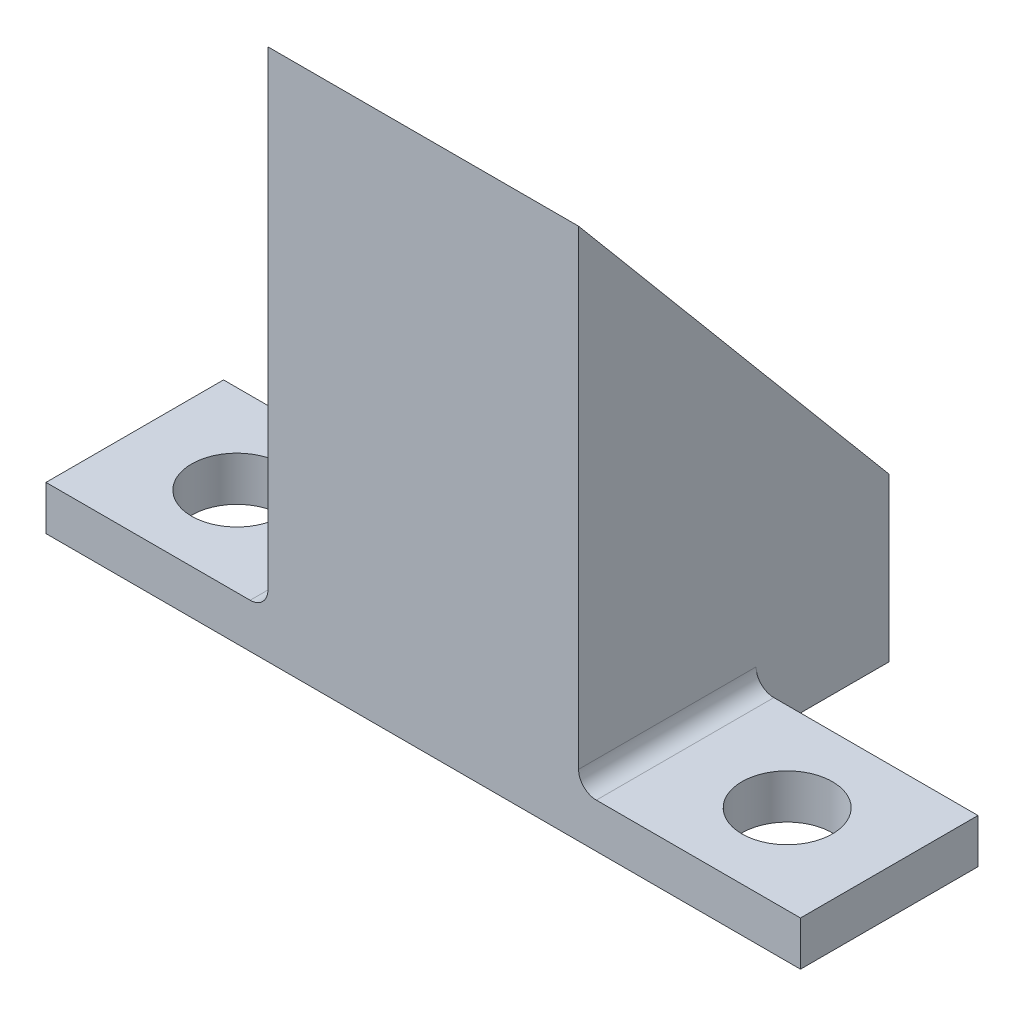
ISO-10303-21;
HEADER;
FILE_DESCRIPTION(('STEP AP214'),'2;1');
FILE_NAME('part.step','',(''),(''),'','','');
FILE_SCHEMA(('AUTOMOTIVE_DESIGN { 1 0 10303 214 1 1 1 1 }'));
ENDSEC;
DATA;
#1=APPLICATION_CONTEXT('core data for automotive mechanical design processes');
#2=APPLICATION_PROTOCOL_DEFINITION('international standard','automotive_design',2000,#1);
#3=PRODUCT_CONTEXT('',#1,'mechanical');
#4=PRODUCT('Part','Part','',(#3));
#5=PRODUCT_RELATED_PRODUCT_CATEGORY('part','',(#4));
#6=PRODUCT_DEFINITION_FORMATION('','',#4);
#7=PRODUCT_DEFINITION_CONTEXT('part definition',#1,'design');
#8=PRODUCT_DEFINITION('design','',#6,#7);
#9=PRODUCT_DEFINITION_SHAPE('','',#8);
#10=(LENGTH_UNIT() NAMED_UNIT(*) SI_UNIT(.MILLI.,.METRE.));
#11=(NAMED_UNIT(*) PLANE_ANGLE_UNIT() SI_UNIT($,.RADIAN.));
#12=(NAMED_UNIT(*) SI_UNIT($,.STERADIAN.) SOLID_ANGLE_UNIT());
#13=UNCERTAINTY_MEASURE_WITH_UNIT(LENGTH_MEASURE(1.E-05),#10,'distance_accuracy_value','');
#14=(GEOMETRIC_REPRESENTATION_CONTEXT(3) GLOBAL_UNCERTAINTY_ASSIGNED_CONTEXT((#13)) GLOBAL_UNIT_ASSIGNED_CONTEXT((#10,
#11,#12)) REPRESENTATION_CONTEXT('',''));
#15=CARTESIAN_POINT('',(0.,0.,0.));
#16=DIRECTION('',(0.,0.,1.));
#17=DIRECTION('',(1.,0.,0.));
#18=AXIS2_PLACEMENT_3D('',#15,#16,#17);
#19=CARTESIAN_POINT('',(0.,76.2,0.));
#20=DIRECTION('',(1.,0.,0.));
#21=DIRECTION('',(0.,0.,-1.));
#22=AXIS2_PLACEMENT_3D('',#19,#20,#21);
#23=PLANE('',#22);
#24=DIRECTION('',(0.,-1.,0.));
#25=VECTOR('',#24,1.);
#26=CARTESIAN_POINT('',(0.,0.,-25.4));
#27=LINE('',#26,#25);
#28=CARTESIAN_POINT('',(0.,8.89,-25.4));
#29=VERTEX_POINT('',#28);
#30=CARTESIAN_POINT('',(0.,0.,-25.4));
#31=VERTEX_POINT('',#30);
#32=EDGE_CURVE('E50',#29,#31,#27,.T.);
#33=ORIENTED_EDGE('',*,*,#32,.F.);
#34=DIRECTION('',(0.,0.,-1.));
#35=VECTOR('',#34,1.);
#36=CARTESIAN_POINT('',(0.,8.89,0.));
#37=LINE('',#36,#35);
#38=CARTESIAN_POINT('',(0.,8.89000000000002,0.));
#39=VERTEX_POINT('',#38);
#40=EDGE_CURVE('E55',#29,#39,#37,.F.);
#41=ORIENTED_EDGE('',*,*,#40,.T.);
#42=DIRECTION('',(0.,-1.,0.));
#43=VECTOR('',#42,1.);
#44=CARTESIAN_POINT('',(0.,76.2,0.));
#45=LINE('',#44,#43);
#46=CARTESIAN_POINT('',(0.,76.2,0.));
#47=VERTEX_POINT('',#46);
#48=EDGE_CURVE('E202',#47,#39,#45,.T.);
#49=ORIENTED_EDGE('',*,*,#48,.F.);
#50=DIRECTION('',(0.,-0.766044443118974,-0.642787609686544));
#51=VECTOR('',#50,1.);
#52=CARTESIAN_POINT('',(0.,76.2,0.));
#53=LINE('',#52,#51);
#54=CARTESIAN_POINT('',(0.,23.226552809188,-44.45));
#55=VERTEX_POINT('',#54);
#56=EDGE_CURVE('E188',#47,#55,#53,.T.);
#57=ORIENTED_EDGE('',*,*,#56,.T.);
#58=DIRECTION('',(0.,-1.,0.));
#59=VECTOR('',#58,1.);
#60=CARTESIAN_POINT('',(0.,76.2,-44.45));
#61=LINE('',#60,#59);
#62=CARTESIAN_POINT('',(0.,0.,-44.45));
#63=VERTEX_POINT('',#62);
#64=EDGE_CURVE('E185',#55,#63,#61,.T.);
#65=ORIENTED_EDGE('',*,*,#64,.T.);
#66=DIRECTION('',(0.,0.,1.));
#67=VECTOR('',#66,1.);
#68=CARTESIAN_POINT('',(0.,0.,0.));
#69=LINE('',#68,#67);
#70=EDGE_CURVE('E191',#63,#31,#69,.T.);
#71=ORIENTED_EDGE('',*,*,#70,.T.);
#72=EDGE_LOOP('',(#33,#41,#49,#57,#65,#71));
#73=FACE_BOUND('',#72,.T.);
#74=ADVANCED_FACE('F35',(#73),#23,.F.);
#75=CARTESIAN_POINT('',(44.45,76.2,0.));
#76=DIRECTION('',(-1.,0.,0.));
#77=DIRECTION('',(0.,0.,1.));
#78=AXIS2_PLACEMENT_3D('',#75,#76,#77);
#79=PLANE('',#78);
#80=DIRECTION('',(0.,-1.,0.));
#81=VECTOR('',#80,1.);
#82=CARTESIAN_POINT('',(44.45,76.2,0.));
#83=LINE('',#82,#81);
#84=CARTESIAN_POINT('',(44.45,76.2,0.));
#85=VERTEX_POINT('',#84);
#86=CARTESIAN_POINT('',(44.45,8.89000000000002,0.));
#87=VERTEX_POINT('',#86);
#88=EDGE_CURVE('E194',#85,#87,#83,.T.);
#89=ORIENTED_EDGE('',*,*,#88,.T.);
#90=DIRECTION('',(0.,0.,1.));
#91=VECTOR('',#90,1.);
#92=CARTESIAN_POINT('',(44.45,8.89,-25.4));
#93=LINE('',#92,#91);
#94=CARTESIAN_POINT('',(44.45,8.89,-25.4));
#95=VERTEX_POINT('',#94);
#96=EDGE_CURVE('E209',#87,#95,#93,.F.);
#97=ORIENTED_EDGE('',*,*,#96,.T.);
#98=DIRECTION('',(0.,1.,0.));
#99=VECTOR('',#98,1.);
#100=CARTESIAN_POINT('',(44.45,0.,-25.4));
#101=LINE('',#100,#99);
#102=CARTESIAN_POINT('',(44.45,0.,-25.4));
#103=VERTEX_POINT('',#102);
#104=EDGE_CURVE('E157',#103,#95,#101,.T.);
#105=ORIENTED_EDGE('',*,*,#104,.F.);
#106=DIRECTION('',(0.,0.,-1.));
#107=VECTOR('',#106,1.);
#108=CARTESIAN_POINT('',(44.45,0.,0.));
#109=LINE('',#108,#107);
#110=CARTESIAN_POINT('',(44.45,0.,-44.45));
#111=VERTEX_POINT('',#110);
#112=EDGE_CURVE('E195',#103,#111,#109,.T.);
#113=ORIENTED_EDGE('',*,*,#112,.T.);
#114=DIRECTION('',(0.,-1.,0.));
#115=VECTOR('',#114,1.);
#116=CARTESIAN_POINT('',(44.45,0.,-44.45));
#117=LINE('',#116,#115);
#118=CARTESIAN_POINT('',(44.45,23.226552809188,-44.45));
#119=VERTEX_POINT('',#118);
#120=EDGE_CURVE('E180',#119,#111,#117,.T.);
#121=ORIENTED_EDGE('',*,*,#120,.F.);
#122=DIRECTION('',(0.,-0.766044443118974,-0.642787609686544));
#123=VECTOR('',#122,1.);
#124=CARTESIAN_POINT('',(44.45,31.4840044308904,-37.5211753897652));
#125=LINE('',#124,#123);
#126=EDGE_CURVE('E177',#85,#119,#125,.T.);
#127=ORIENTED_EDGE('',*,*,#126,.F.);
#128=EDGE_LOOP('',(#89,#97,#105,#113,#121,#127));
#129=FACE_BOUND('',#128,.T.);
#130=ADVANCED_FACE('F231',(#129),#79,.F.);
#131=CARTESIAN_POINT('',(0.,76.2,0.));
#132=DIRECTION('',(0.,0.,-1.));
#133=DIRECTION('',(-1.,0.,0.));
#134=AXIS2_PLACEMENT_3D('',#131,#132,#133);
#135=PLANE('',#134);
#136=DIRECTION('',(1.,0.,0.));
#137=VECTOR('',#136,1.);
#138=CARTESIAN_POINT('',(0.,0.,0.));
#139=LINE('',#138,#137);
#140=CARTESIAN_POINT('',(-31.75,0.,0.));
#141=VERTEX_POINT('',#140);
#142=CARTESIAN_POINT('',(76.2,0.,0.));
#143=VERTEX_POINT('',#142);
#144=EDGE_CURVE('E197',#141,#143,#139,.T.);
#145=ORIENTED_EDGE('',*,*,#144,.T.);
#146=DIRECTION('',(0.,-1.,0.));
#147=VECTOR('',#146,1.);
#148=CARTESIAN_POINT('',(76.2,0.,0.));
#149=LINE('',#148,#147);
#150=CARTESIAN_POINT('',(76.2,6.35,0.));
#151=VERTEX_POINT('',#150);
#152=EDGE_CURVE('E158',#151,#143,#149,.T.);
#153=ORIENTED_EDGE('',*,*,#152,.F.);
#154=DIRECTION('',(-1.,0.,0.));
#155=VECTOR('',#154,1.);
#156=CARTESIAN_POINT('',(76.2,6.35,0.));
#157=LINE('',#156,#155);
#158=CARTESIAN_POINT('',(46.99,6.35,0.));
#159=VERTEX_POINT('',#158);
#160=EDGE_CURVE('E167',#151,#159,#157,.T.);
#161=ORIENTED_EDGE('',*,*,#160,.T.);
#162=CARTESIAN_POINT('',(46.99,8.89,0.));
#163=DIRECTION('',(0.,0.,-1.));
#164=DIRECTION('',(-1.,0.,0.));
#165=AXIS2_PLACEMENT_3D('',#162,#163,#164);
#166=CIRCLE('',#165,2.54);
#167=EDGE_CURVE('E212',#159,#87,#166,.T.);
#168=ORIENTED_EDGE('',*,*,#167,.T.);
#169=ORIENTED_EDGE('',*,*,#88,.F.);
#170=DIRECTION('',(1.,0.,0.));
#171=VECTOR('',#170,1.);
#172=CARTESIAN_POINT('',(0.,76.2,0.));
#173=LINE('',#172,#171);
#174=EDGE_CURVE('E192',#47,#85,#173,.T.);
#175=ORIENTED_EDGE('',*,*,#174,.F.);
#176=ORIENTED_EDGE('',*,*,#48,.T.);
#177=CARTESIAN_POINT('',(-2.54,8.89,0.));
#178=DIRECTION('',(0.,0.,-1.));
#179=DIRECTION('',(-1.,0.,0.));
#180=AXIS2_PLACEMENT_3D('',#177,#178,#179);
#181=CIRCLE('',#180,2.54);
#182=CARTESIAN_POINT('',(-2.54,6.35,0.));
#183=VERTEX_POINT('',#182);
#184=EDGE_CURVE('E11',#39,#183,#181,.T.);
#185=ORIENTED_EDGE('',*,*,#184,.T.);
#186=DIRECTION('',(1.,0.,0.));
#187=VECTOR('',#186,1.);
#188=CARTESIAN_POINT('',(-31.75,6.35,0.));
#189=LINE('',#188,#187);
#190=CARTESIAN_POINT('',(-31.75,6.35,0.));
#191=VERTEX_POINT('',#190);
#192=EDGE_CURVE('E128',#191,#183,#189,.T.);
#193=ORIENTED_EDGE('',*,*,#192,.F.);
#194=DIRECTION('',(0.,1.,0.));
#195=VECTOR('',#194,1.);
#196=CARTESIAN_POINT('',(-31.75,0.,0.));
#197=LINE('',#196,#195);
#198=EDGE_CURVE('E135',#141,#191,#197,.T.);
#199=ORIENTED_EDGE('',*,*,#198,.F.);
#200=EDGE_LOOP('',(#145,#153,#161,#168,#169,#175,#176,#185,#193,#199));
#201=FACE_BOUND('',#200,.T.);
#202=ADVANCED_FACE('F144',(#201),#135,.F.);
#203=CARTESIAN_POINT('',(0.,0.,0.));
#204=DIRECTION('',(0.,-1.,0.));
#205=DIRECTION('',(0.,0.,-1.));
#206=AXIS2_PLACEMENT_3D('',#203,#204,#205);
#207=PLANE('',#206);
#208=CARTESIAN_POINT('',(-17.145,0.,-12.7));
#209=DIRECTION('',(0.,-1.,0.));
#210=DIRECTION('',(0.,0.,-1.));
#211=AXIS2_PLACEMENT_3D('',#208,#209,#210);
#212=CIRCLE('',#211,6.47699999999998);
#213=CARTESIAN_POINT('',(-17.145,0.,-6.22300000000001));
#214=VERTEX_POINT('',#213);
#215=EDGE_CURVE('E283',#214,#214,#212,.F.);
#216=ORIENTED_EDGE('',*,*,#215,.T.);
#217=EDGE_LOOP('',(#216));
#218=FACE_BOUND('',#217,.T.);
#219=CARTESIAN_POINT('',(61.595,0.,-12.7));
#220=DIRECTION('',(0.,-1.,0.));
#221=DIRECTION('',(0.,0.,-1.));
#222=AXIS2_PLACEMENT_3D('',#219,#220,#221);
#223=CIRCLE('',#222,6.47699999999998);
#224=CARTESIAN_POINT('',(61.595,0.,-6.22300000000001));
#225=VERTEX_POINT('',#224);
#226=EDGE_CURVE('E149',#225,#225,#223,.T.);
#227=ORIENTED_EDGE('',*,*,#226,.F.);
#228=EDGE_LOOP('',(#227));
#229=FACE_BOUND('',#228,.T.);
#230=DIRECTION('',(-1.,0.,0.));
#231=VECTOR('',#230,1.);
#232=CARTESIAN_POINT('',(0.,0.,-44.45));
#233=LINE('',#232,#231);
#234=EDGE_CURVE('E204',#111,#63,#233,.T.);
#235=ORIENTED_EDGE('',*,*,#234,.F.);
#236=ORIENTED_EDGE('',*,*,#112,.F.);
#237=DIRECTION('',(-1.,0.,0.));
#238=VECTOR('',#237,1.);
#239=CARTESIAN_POINT('',(76.2,0.,-25.4));
#240=LINE('',#239,#238);
#241=CARTESIAN_POINT('',(76.2,0.,-25.4));
#242=VERTEX_POINT('',#241);
#243=EDGE_CURVE('E174',#242,#103,#240,.T.);
#244=ORIENTED_EDGE('',*,*,#243,.F.);
#245=DIRECTION('',(0.,0.,-1.));
#246=VECTOR('',#245,1.);
#247=CARTESIAN_POINT('',(76.2,0.,0.));
#248=LINE('',#247,#246);
#249=EDGE_CURVE('E161',#143,#242,#248,.T.);
#250=ORIENTED_EDGE('',*,*,#249,.F.);
#251=ORIENTED_EDGE('',*,*,#144,.F.);
#252=DIRECTION('',(0.,0.,1.));
#253=VECTOR('',#252,1.);
#254=CARTESIAN_POINT('',(-31.75,0.,0.));
#255=LINE('',#254,#253);
#256=CARTESIAN_POINT('',(-31.75,0.,-25.4));
#257=VERTEX_POINT('',#256);
#258=EDGE_CURVE('E141',#257,#141,#255,.T.);
#259=ORIENTED_EDGE('',*,*,#258,.F.);
#260=DIRECTION('',(1.,0.,0.));
#261=VECTOR('',#260,1.);
#262=CARTESIAN_POINT('',(-31.75,0.,-25.4));
#263=LINE('',#262,#261);
#264=EDGE_CURVE('E151',#257,#31,#263,.T.);
#265=ORIENTED_EDGE('',*,*,#264,.T.);
#266=ORIENTED_EDGE('',*,*,#70,.F.);
#267=EDGE_LOOP('',(#235,#236,#244,#250,#251,#259,#265,#266));
#268=FACE_BOUND('',#267,.T.);
#269=ADVANCED_FACE('F269',(#218,#229,#268),#207,.T.);
#270=CARTESIAN_POINT('',(-31.75,31.4840044308904,-37.5211753897652));
#271=DIRECTION('',(0.,-0.642787609686544,0.766044443118974));
#272=DIRECTION('',(0.,-0.766044443118974,-0.642787609686544));
#273=AXIS2_PLACEMENT_3D('',#270,#271,#272);
#274=PLANE('',#273);
#275=ORIENTED_EDGE('',*,*,#174,.T.);
#276=ORIENTED_EDGE('',*,*,#126,.T.);
#277=DIRECTION('',(1.,0.,0.));
#278=VECTOR('',#277,1.);
#279=CARTESIAN_POINT('',(-31.75,23.226552809188,-44.45));
#280=LINE('',#279,#278);
#281=EDGE_CURVE('E183',#55,#119,#280,.T.);
#282=ORIENTED_EDGE('',*,*,#281,.F.);
#283=ORIENTED_EDGE('',*,*,#56,.F.);
#284=EDGE_LOOP('',(#275,#276,#282,#283));
#285=FACE_BOUND('',#284,.T.);
#286=ADVANCED_FACE('F277',(#285),#274,.F.);
#287=CARTESIAN_POINT('',(-31.75,0.,-44.45));
#288=DIRECTION('',(0.,0.,1.));
#289=DIRECTION('',(1.,0.,0.));
#290=AXIS2_PLACEMENT_3D('',#287,#288,#289);
#291=PLANE('',#290);
#292=ORIENTED_EDGE('',*,*,#281,.T.);
#293=ORIENTED_EDGE('',*,*,#120,.T.);
#294=ORIENTED_EDGE('',*,*,#234,.T.);
#295=ORIENTED_EDGE('',*,*,#64,.F.);
#296=EDGE_LOOP('',(#292,#293,#294,#295));
#297=FACE_BOUND('',#296,.T.);
#298=ADVANCED_FACE('F274',(#297),#291,.F.);
#299=CARTESIAN_POINT('',(76.2,0.,-25.4));
#300=DIRECTION('',(0.,0.,1.));
#301=DIRECTION('',(0.,-1.,0.));
#302=AXIS2_PLACEMENT_3D('',#299,#300,#301);
#303=PLANE('',#302);
#304=ORIENTED_EDGE('',*,*,#104,.T.);
#305=CARTESIAN_POINT('',(46.99,8.89,-25.4));
#306=DIRECTION('',(0.,0.,1.));
#307=DIRECTION('',(0.,-1.,0.));
#308=AXIS2_PLACEMENT_3D('',#305,#306,#307);
#309=CIRCLE('',#308,2.54);
#310=CARTESIAN_POINT('',(46.99,6.35,-25.4));
#311=VERTEX_POINT('',#310);
#312=EDGE_CURVE('E214',#95,#311,#309,.T.);
#313=ORIENTED_EDGE('',*,*,#312,.T.);
#314=DIRECTION('',(-1.,0.,0.));
#315=VECTOR('',#314,1.);
#316=CARTESIAN_POINT('',(76.2,6.35,-25.4));
#317=LINE('',#316,#315);
#318=CARTESIAN_POINT('',(76.2,6.35,-25.4));
#319=VERTEX_POINT('',#318);
#320=EDGE_CURVE('E171',#319,#311,#317,.T.);
#321=ORIENTED_EDGE('',*,*,#320,.F.);
#322=DIRECTION('',(0.,1.,0.));
#323=VECTOR('',#322,1.);
#324=CARTESIAN_POINT('',(76.2,0.,-25.4));
#325=LINE('',#324,#323);
#326=EDGE_CURVE('E163',#242,#319,#325,.T.);
#327=ORIENTED_EDGE('',*,*,#326,.F.);
#328=ORIENTED_EDGE('',*,*,#243,.T.);
#329=EDGE_LOOP('',(#304,#313,#321,#327,#328));
#330=FACE_BOUND('',#329,.T.);
#331=ADVANCED_FACE('F258',(#330),#303,.F.);
#332=CARTESIAN_POINT('',(76.2,6.35,0.));
#333=DIRECTION('',(0.,-1.,0.));
#334=DIRECTION('',(0.,0.,-1.));
#335=AXIS2_PLACEMENT_3D('',#332,#333,#334);
#336=PLANE('',#335);
#337=CARTESIAN_POINT('',(61.595,6.35,-12.7));
#338=DIRECTION('',(0.,1.,0.));
#339=DIRECTION('',(0.,0.,1.));
#340=AXIS2_PLACEMENT_3D('',#337,#338,#339);
#341=CIRCLE('',#340,6.47699999999998);
#342=CARTESIAN_POINT('',(61.595,6.35,-6.22300000000001));
#343=VERTEX_POINT('',#342);
#344=EDGE_CURVE('E146',#343,#343,#341,.T.);
#345=ORIENTED_EDGE('',*,*,#344,.F.);
#346=EDGE_LOOP('',(#345));
#347=FACE_BOUND('',#346,.T.);
#348=ORIENTED_EDGE('',*,*,#320,.T.);
#349=DIRECTION('',(0.,0.,1.));
#350=VECTOR('',#349,1.);
#351=CARTESIAN_POINT('',(46.99,6.35,0.));
#352=LINE('',#351,#350);
#353=EDGE_CURVE('E206',#311,#159,#352,.T.);
#354=ORIENTED_EDGE('',*,*,#353,.T.);
#355=ORIENTED_EDGE('',*,*,#160,.F.);
#356=DIRECTION('',(0.,0.,1.));
#357=VECTOR('',#356,1.);
#358=CARTESIAN_POINT('',(76.2,6.35,0.));
#359=LINE('',#358,#357);
#360=EDGE_CURVE('E165',#319,#151,#359,.T.);
#361=ORIENTED_EDGE('',*,*,#360,.F.);
#362=EDGE_LOOP('',(#348,#354,#355,#361));
#363=FACE_BOUND('',#362,.T.);
#364=ADVANCED_FACE('F250',(#347,#363),#336,.F.);
#365=CARTESIAN_POINT('',(76.2,0.,0.));
#366=DIRECTION('',(-1.,0.,0.));
#367=DIRECTION('',(0.,0.,1.));
#368=AXIS2_PLACEMENT_3D('',#365,#366,#367);
#369=PLANE('',#368);
#370=ORIENTED_EDGE('',*,*,#152,.T.);
#371=ORIENTED_EDGE('',*,*,#249,.T.);
#372=ORIENTED_EDGE('',*,*,#326,.T.);
#373=ORIENTED_EDGE('',*,*,#360,.T.);
#374=EDGE_LOOP('',(#370,#371,#372,#373));
#375=FACE_BOUND('',#374,.T.);
#376=ADVANCED_FACE('F242',(#375),#369,.F.);
#377=CARTESIAN_POINT('',(46.99,8.89,0.));
#378=DIRECTION('',(0.,0.,-1.));
#379=DIRECTION('',(-1.,0.,0.));
#380=AXIS2_PLACEMENT_3D('',#377,#378,#379);
#381=CYLINDRICAL_SURFACE('',#380,2.54);
#382=ORIENTED_EDGE('',*,*,#312,.F.);
#383=ORIENTED_EDGE('',*,*,#96,.F.);
#384=ORIENTED_EDGE('',*,*,#167,.F.);
#385=ORIENTED_EDGE('',*,*,#353,.F.);
#386=EDGE_LOOP('',(#382,#383,#384,#385));
#387=FACE_BOUND('',#386,.T.);
#388=ADVANCED_FACE('F239',(#387),#381,.F.);
#389=CARTESIAN_POINT('',(61.595,-31.75,-12.7));
#390=DIRECTION('',(0.,1.,0.));
#391=DIRECTION('',(0.,0.,1.));
#392=AXIS2_PLACEMENT_3D('',#389,#390,#391);
#393=CYLINDRICAL_SURFACE('',#392,6.47699999999998);
#394=CARTESIAN_POINT('',(61.595,0.,-6.22300000000001));
#395=CARTESIAN_POINT('',(61.595,0.0661458333333411,-6.22300000000001));
#396=CARTESIAN_POINT('',(61.595,0.132291666666675,-6.22300000000001));
#397=CARTESIAN_POINT('',(61.595,0.264583333333341,-6.22300000000001));
#398=CARTESIAN_POINT('',(61.595,0.330729166666673,-6.22300000000001));
#399=CARTESIAN_POINT('',(61.595,0.463020833333339,-6.22300000000001));
#400=CARTESIAN_POINT('',(61.595,0.529166666666673,-6.22300000000001));
#401=CARTESIAN_POINT('',(61.595,0.661458333333339,-6.22300000000001));
#402=CARTESIAN_POINT('',(61.595,0.727604166666671,-6.22300000000001));
#403=CARTESIAN_POINT('',(61.595,0.859895833333337,-6.22300000000001));
#404=CARTESIAN_POINT('',(61.595,0.926041666666671,-6.22300000000001));
#405=CARTESIAN_POINT('',(61.595,1.05833333333334,-6.22300000000001));
#406=CARTESIAN_POINT('',(61.595,1.12447916666667,-6.22300000000001));
#407=CARTESIAN_POINT('',(61.595,1.25677083333334,-6.22300000000001));
#408=CARTESIAN_POINT('',(61.595,1.32291666666667,-6.22300000000001));
#409=CARTESIAN_POINT('',(61.595,1.45520833333334,-6.22300000000001));
#410=CARTESIAN_POINT('',(61.595,1.52135416666667,-6.22300000000001));
#411=CARTESIAN_POINT('',(61.595,1.65364583333334,-6.22300000000001));
#412=CARTESIAN_POINT('',(61.595,1.71979166666667,-6.22300000000001));
#413=CARTESIAN_POINT('',(61.595,1.85208333333334,-6.22300000000001));
#414=CARTESIAN_POINT('',(61.595,1.91822916666667,-6.22300000000001));
#415=CARTESIAN_POINT('',(61.595,2.05052083333334,-6.22300000000001));
#416=CARTESIAN_POINT('',(61.595,2.11666666666667,-6.22300000000001));
#417=CARTESIAN_POINT('',(61.595,2.24895833333334,-6.22300000000001));
#418=CARTESIAN_POINT('',(61.595,2.31510416666667,-6.22300000000001));
#419=CARTESIAN_POINT('',(61.595,2.44739583333334,-6.22300000000001));
#420=CARTESIAN_POINT('',(61.595,2.51354166666667,-6.22300000000001));
#421=CARTESIAN_POINT('',(61.595,2.64583333333334,-6.22300000000001));
#422=CARTESIAN_POINT('',(61.595,2.71197916666667,-6.22300000000001));
#423=CARTESIAN_POINT('',(61.595,2.84427083333334,-6.22300000000001));
#424=CARTESIAN_POINT('',(61.595,2.91041666666667,-6.22300000000001));
#425=CARTESIAN_POINT('',(61.595,3.04270833333334,-6.22300000000001));
#426=CARTESIAN_POINT('',(61.595,3.10885416666667,-6.22300000000001));
#427=CARTESIAN_POINT('',(61.595,3.24114583333334,-6.22300000000001));
#428=CARTESIAN_POINT('',(61.595,3.30729166666667,-6.22300000000001));
#429=CARTESIAN_POINT('',(61.595,3.43958333333334,-6.22300000000001));
#430=CARTESIAN_POINT('',(61.595,3.50572916666667,-6.22300000000001));
#431=CARTESIAN_POINT('',(61.595,3.63802083333334,-6.22300000000001));
#432=CARTESIAN_POINT('',(61.595,3.70416666666667,-6.22300000000001));
#433=CARTESIAN_POINT('',(61.595,3.83645833333334,-6.22300000000001));
#434=CARTESIAN_POINT('',(61.595,3.90260416666667,-6.22300000000001));
#435=CARTESIAN_POINT('',(61.595,4.03489583333333,-6.22300000000001));
#436=CARTESIAN_POINT('',(61.595,4.10104166666667,-6.22300000000001));
#437=CARTESIAN_POINT('',(61.595,4.23333333333334,-6.22300000000001));
#438=CARTESIAN_POINT('',(61.595,4.29947916666667,-6.22300000000001));
#439=CARTESIAN_POINT('',(61.595,4.43177083333334,-6.22300000000001));
#440=CARTESIAN_POINT('',(61.595,4.49791666666667,-6.22300000000001));
#441=CARTESIAN_POINT('',(61.595,4.63020833333333,-6.22300000000001));
#442=CARTESIAN_POINT('',(61.595,4.69635416666667,-6.22300000000001));
#443=CARTESIAN_POINT('',(61.595,4.82864583333334,-6.22300000000001));
#444=CARTESIAN_POINT('',(61.595,4.89479166666667,-6.22300000000001));
#445=CARTESIAN_POINT('',(61.595,5.02708333333334,-6.22300000000001));
#446=CARTESIAN_POINT('',(61.595,5.09322916666667,-6.22300000000001));
#447=CARTESIAN_POINT('',(61.595,5.22552083333333,-6.22300000000001));
#448=CARTESIAN_POINT('',(61.595,5.29166666666667,-6.22300000000001));
#449=CARTESIAN_POINT('',(61.595,5.42395833333334,-6.22300000000001));
#450=CARTESIAN_POINT('',(61.595,5.49010416666667,-6.22300000000001));
#451=CARTESIAN_POINT('',(61.595,5.62239583333334,-6.22300000000001));
#452=CARTESIAN_POINT('',(61.595,5.68854166666667,-6.22300000000001));
#453=CARTESIAN_POINT('',(61.595,5.82083333333333,-6.22300000000001));
#454=CARTESIAN_POINT('',(61.595,5.88697916666667,-6.22300000000001));
#455=CARTESIAN_POINT('',(61.595,6.01927083333334,-6.22300000000001));
#456=CARTESIAN_POINT('',(61.595,6.08541666666667,-6.22300000000001));
#457=CARTESIAN_POINT('',(61.595,6.21770833333333,-6.22300000000001));
#458=CARTESIAN_POINT('',(61.595,6.28385416666667,-6.22300000000001));
#459=CARTESIAN_POINT('',(61.595,6.35,-6.22300000000001));
#460=B_SPLINE_CURVE_WITH_KNOTS('',3,(#394,#395,#396,#397,#398,#399,#400,#401,#402,#403,#404,
#405,#406,#407,#408,#409,#410,#411,#412,#413,#414,#415,#416,#417,#418,#419,#420,#421,#422,#423,
#424,#425,#426,#427,#428,#429,#430,#431,#432,#433,#434,#435,#436,#437,#438,#439,#440,#441,#442,
#443,#444,#445,#446,#447,#448,#449,#450,#451,#452,#453,#454,#455,#456,#457,#458,#459),
.UNSPECIFIED.,.F.,.F.,(4,2,2,2,2,2,2,2,2,2,2,2,2,2,2,2,2,2,2,2,2,2,2,2,2,2,2,2,2,2,2,2,4),(0.,
0.198437500000002,0.396874999999998,0.5953125,0.793749999999996,0.992187499999998,1.190625,
1.3890625,1.5875,1.7859375,1.984375,2.1828125,2.38125,2.5796875,2.778125,2.97656249999999,3.175,
3.3734375,3.571875,3.7703125,3.96874999999999,4.1671875,4.365625,4.56406249999999,4.7625,
4.9609375,5.15937499999999,5.3578125,5.55625,5.75468749999999,5.953125,6.15156249999999,
6.34999999999999),.UNSPECIFIED.);
#461=EDGE_CURVE('BSEAM241',#225,#343,#460,.T.);
#462=ORIENTED_EDGE('',*,*,#226,.T.);
#463=ORIENTED_EDGE('',*,*,#344,.T.);
#464=ORIENTED_EDGE('',*,*,#461,.T.);
#465=ORIENTED_EDGE('',*,*,#461,.F.);
#466=EDGE_LOOP('',(#462,#464,#463,#465));
#467=FACE_BOUND('',#466,.T.);
#468=ADVANCED_FACE('F241',(#467),#393,.F.);
#469=CARTESIAN_POINT('',(-31.75,6.35,0.));
#470=DIRECTION('',(0.,-1.,0.));
#471=DIRECTION('',(0.,0.,-1.));
#472=AXIS2_PLACEMENT_3D('',#469,#470,#471);
#473=PLANE('',#472);
#474=CARTESIAN_POINT('',(-17.145,6.35,-12.7));
#475=DIRECTION('',(0.,-1.,0.));
#476=DIRECTION('',(0.,0.,1.));
#477=AXIS2_PLACEMENT_3D('',#474,#475,#476);
#478=CIRCLE('',#477,6.47699999999998);
#479=CARTESIAN_POINT('',(-17.145,6.35,-6.22300000000001));
#480=VERTEX_POINT('',#479);
#481=EDGE_CURVE('E285',#480,#480,#478,.T.);
#482=ORIENTED_EDGE('',*,*,#481,.T.);
#483=EDGE_LOOP('',(#482));
#484=FACE_BOUND('',#483,.T.);
#485=ORIENTED_EDGE('',*,*,#192,.T.);
#486=DIRECTION('',(0.,0.,-1.));
#487=VECTOR('',#486,1.);
#488=CARTESIAN_POINT('',(-2.54,6.35,-25.4));
#489=LINE('',#488,#487);
#490=CARTESIAN_POINT('',(-2.54,6.35,-25.4));
#491=VERTEX_POINT('',#490);
#492=EDGE_CURVE('E216',#183,#491,#489,.T.);
#493=ORIENTED_EDGE('',*,*,#492,.T.);
#494=DIRECTION('',(1.,0.,0.));
#495=VECTOR('',#494,1.);
#496=CARTESIAN_POINT('',(-31.75,6.35,-25.4));
#497=LINE('',#496,#495);
#498=CARTESIAN_POINT('',(-31.75,6.35,-25.4));
#499=VERTEX_POINT('',#498);
#500=EDGE_CURVE('E131',#499,#491,#497,.T.);
#501=ORIENTED_EDGE('',*,*,#500,.F.);
#502=DIRECTION('',(0.,0.,-1.));
#503=VECTOR('',#502,1.);
#504=CARTESIAN_POINT('',(-31.75,6.35,0.));
#505=LINE('',#504,#503);
#506=EDGE_CURVE('E123',#191,#499,#505,.T.);
#507=ORIENTED_EDGE('',*,*,#506,.F.);
#508=EDGE_LOOP('',(#485,#493,#501,#507));
#509=FACE_BOUND('',#508,.T.);
#510=ADVANCED_FACE('F125',(#484,#509),#473,.F.);
#511=CARTESIAN_POINT('',(-31.75,0.,-25.4));
#512=DIRECTION('',(0.,0.,1.));
#513=DIRECTION('',(1.,0.,0.));
#514=AXIS2_PLACEMENT_3D('',#511,#512,#513);
#515=PLANE('',#514);
#516=ORIENTED_EDGE('',*,*,#32,.T.);
#517=ORIENTED_EDGE('',*,*,#264,.F.);
#518=DIRECTION('',(0.,-1.,0.));
#519=VECTOR('',#518,1.);
#520=CARTESIAN_POINT('',(-31.75,0.,-25.4));
#521=LINE('',#520,#519);
#522=EDGE_CURVE('E134',#499,#257,#521,.T.);
#523=ORIENTED_EDGE('',*,*,#522,.F.);
#524=ORIENTED_EDGE('',*,*,#500,.T.);
#525=CARTESIAN_POINT('',(-2.54,8.89,-25.4));
#526=DIRECTION('',(0.,0.,1.));
#527=DIRECTION('',(1.,0.,0.));
#528=AXIS2_PLACEMENT_3D('',#525,#526,#527);
#529=CIRCLE('',#528,2.54);
#530=EDGE_CURVE('E43',#491,#29,#529,.T.);
#531=ORIENTED_EDGE('',*,*,#530,.T.);
#532=EDGE_LOOP('',(#516,#517,#523,#524,#531));
#533=FACE_BOUND('',#532,.T.);
#534=ADVANCED_FACE('F219',(#533),#515,.F.);
#535=CARTESIAN_POINT('',(-31.75,0.,0.));
#536=DIRECTION('',(-1.,0.,0.));
#537=DIRECTION('',(0.,0.,1.));
#538=AXIS2_PLACEMENT_3D('',#535,#536,#537);
#539=PLANE('',#538);
#540=ORIENTED_EDGE('',*,*,#198,.T.);
#541=ORIENTED_EDGE('',*,*,#506,.T.);
#542=ORIENTED_EDGE('',*,*,#522,.T.);
#543=ORIENTED_EDGE('',*,*,#258,.T.);
#544=EDGE_LOOP('',(#540,#541,#542,#543));
#545=FACE_BOUND('',#544,.T.);
#546=ADVANCED_FACE('F139',(#545),#539,.T.);
#547=CARTESIAN_POINT('',(-17.145,-31.75,-12.7));
#548=DIRECTION('',(0.,1.,0.));
#549=DIRECTION('',(0.,0.,1.));
#550=AXIS2_PLACEMENT_3D('',#547,#548,#549);
#551=CYLINDRICAL_SURFACE('',#550,6.47699999999998);
#552=CARTESIAN_POINT('',(-17.145,0.,-6.22300000000001));
#553=CARTESIAN_POINT('',(-17.145,0.0661458333333411,-6.22300000000001));
#554=CARTESIAN_POINT('',(-17.145,0.132291666666675,-6.22300000000001));
#555=CARTESIAN_POINT('',(-17.145,0.264583333333341,-6.22300000000001));
#556=CARTESIAN_POINT('',(-17.145,0.330729166666673,-6.22300000000001));
#557=CARTESIAN_POINT('',(-17.145,0.463020833333339,-6.22300000000001));
#558=CARTESIAN_POINT('',(-17.145,0.529166666666673,-6.22300000000001));
#559=CARTESIAN_POINT('',(-17.145,0.661458333333339,-6.22300000000001));
#560=CARTESIAN_POINT('',(-17.145,0.727604166666671,-6.22300000000001));
#561=CARTESIAN_POINT('',(-17.145,0.859895833333337,-6.22300000000001));
#562=CARTESIAN_POINT('',(-17.145,0.926041666666671,-6.22300000000001));
#563=CARTESIAN_POINT('',(-17.145,1.05833333333334,-6.22300000000001));
#564=CARTESIAN_POINT('',(-17.145,1.12447916666667,-6.22300000000001));
#565=CARTESIAN_POINT('',(-17.145,1.25677083333334,-6.22300000000001));
#566=CARTESIAN_POINT('',(-17.145,1.32291666666667,-6.22300000000001));
#567=CARTESIAN_POINT('',(-17.145,1.45520833333334,-6.22300000000001));
#568=CARTESIAN_POINT('',(-17.145,1.52135416666667,-6.22300000000001));
#569=CARTESIAN_POINT('',(-17.145,1.65364583333334,-6.22300000000001));
#570=CARTESIAN_POINT('',(-17.145,1.71979166666667,-6.22300000000001));
#571=CARTESIAN_POINT('',(-17.145,1.85208333333334,-6.22300000000001));
#572=CARTESIAN_POINT('',(-17.145,1.91822916666667,-6.22300000000001));
#573=CARTESIAN_POINT('',(-17.145,2.05052083333334,-6.22300000000001));
#574=CARTESIAN_POINT('',(-17.145,2.11666666666667,-6.22300000000001));
#575=CARTESIAN_POINT('',(-17.145,2.24895833333334,-6.22300000000001));
#576=CARTESIAN_POINT('',(-17.145,2.31510416666667,-6.22300000000001));
#577=CARTESIAN_POINT('',(-17.145,2.44739583333334,-6.22300000000001));
#578=CARTESIAN_POINT('',(-17.145,2.51354166666667,-6.22300000000001));
#579=CARTESIAN_POINT('',(-17.145,2.64583333333334,-6.22300000000001));
#580=CARTESIAN_POINT('',(-17.145,2.71197916666667,-6.22300000000001));
#581=CARTESIAN_POINT('',(-17.145,2.84427083333334,-6.22300000000001));
#582=CARTESIAN_POINT('',(-17.145,2.91041666666667,-6.22300000000001));
#583=CARTESIAN_POINT('',(-17.145,3.04270833333334,-6.22300000000001));
#584=CARTESIAN_POINT('',(-17.145,3.10885416666667,-6.22300000000001));
#585=CARTESIAN_POINT('',(-17.145,3.24114583333334,-6.22300000000001));
#586=CARTESIAN_POINT('',(-17.145,3.30729166666667,-6.22300000000001));
#587=CARTESIAN_POINT('',(-17.145,3.43958333333334,-6.22300000000001));
#588=CARTESIAN_POINT('',(-17.145,3.50572916666667,-6.22300000000001));
#589=CARTESIAN_POINT('',(-17.145,3.63802083333334,-6.22300000000001));
#590=CARTESIAN_POINT('',(-17.145,3.70416666666667,-6.22300000000001));
#591=CARTESIAN_POINT('',(-17.145,3.83645833333334,-6.22300000000001));
#592=CARTESIAN_POINT('',(-17.145,3.90260416666667,-6.22300000000001));
#593=CARTESIAN_POINT('',(-17.145,4.03489583333333,-6.22300000000001));
#594=CARTESIAN_POINT('',(-17.145,4.10104166666667,-6.22300000000001));
#595=CARTESIAN_POINT('',(-17.145,4.23333333333334,-6.22300000000001));
#596=CARTESIAN_POINT('',(-17.145,4.29947916666667,-6.22300000000001));
#597=CARTESIAN_POINT('',(-17.145,4.43177083333334,-6.22300000000001));
#598=CARTESIAN_POINT('',(-17.145,4.49791666666667,-6.22300000000001));
#599=CARTESIAN_POINT('',(-17.145,4.63020833333333,-6.22300000000001));
#600=CARTESIAN_POINT('',(-17.145,4.69635416666667,-6.22300000000001));
#601=CARTESIAN_POINT('',(-17.145,4.82864583333334,-6.22300000000001));
#602=CARTESIAN_POINT('',(-17.145,4.89479166666667,-6.22300000000001));
#603=CARTESIAN_POINT('',(-17.145,5.02708333333334,-6.22300000000001));
#604=CARTESIAN_POINT('',(-17.145,5.09322916666667,-6.22300000000001));
#605=CARTESIAN_POINT('',(-17.145,5.22552083333333,-6.22300000000001));
#606=CARTESIAN_POINT('',(-17.145,5.29166666666667,-6.22300000000001));
#607=CARTESIAN_POINT('',(-17.145,5.42395833333334,-6.22300000000001));
#608=CARTESIAN_POINT('',(-17.145,5.49010416666667,-6.22300000000001));
#609=CARTESIAN_POINT('',(-17.145,5.62239583333334,-6.22300000000001));
#610=CARTESIAN_POINT('',(-17.145,5.68854166666667,-6.22300000000001));
#611=CARTESIAN_POINT('',(-17.145,5.82083333333333,-6.22300000000001));
#612=CARTESIAN_POINT('',(-17.145,5.88697916666667,-6.22300000000001));
#613=CARTESIAN_POINT('',(-17.145,6.01927083333334,-6.22300000000001));
#614=CARTESIAN_POINT('',(-17.145,6.08541666666667,-6.22300000000001));
#615=CARTESIAN_POINT('',(-17.145,6.21770833333333,-6.22300000000001));
#616=CARTESIAN_POINT('',(-17.145,6.28385416666667,-6.22300000000001));
#617=CARTESIAN_POINT('',(-17.145,6.35,-6.22300000000001));
#618=B_SPLINE_CURVE_WITH_KNOTS('',3,(#552,#553,#554,#555,#556,#557,#558,#559,#560,#561,#562,
#563,#564,#565,#566,#567,#568,#569,#570,#571,#572,#573,#574,#575,#576,#577,#578,#579,#580,#581,
#582,#583,#584,#585,#586,#587,#588,#589,#590,#591,#592,#593,#594,#595,#596,#597,#598,#599,#600,
#601,#602,#603,#604,#605,#606,#607,#608,#609,#610,#611,#612,#613,#614,#615,#616,#617),
.UNSPECIFIED.,.F.,.F.,(4,2,2,2,2,2,2,2,2,2,2,2,2,2,2,2,2,2,2,2,2,2,2,2,2,2,2,2,2,2,2,2,4),(0.,
0.198437500000002,0.396874999999998,0.5953125,0.793749999999996,0.992187499999998,1.190625,
1.3890625,1.5875,1.7859375,1.984375,2.1828125,2.38125,2.5796875,2.778125,2.97656249999999,3.175,
3.3734375,3.571875,3.7703125,3.96874999999999,4.1671875,4.365625,4.56406249999999,4.7625,
4.9609375,5.15937499999999,5.3578125,5.55625,5.75468749999999,5.953125,6.15156249999999,
6.34999999999999),.UNSPECIFIED.);
#619=EDGE_CURVE('BSEAM224',#214,#480,#618,.T.);
#620=ORIENTED_EDGE('',*,*,#215,.F.);
#621=ORIENTED_EDGE('',*,*,#481,.F.);
#622=ORIENTED_EDGE('',*,*,#619,.T.);
#623=ORIENTED_EDGE('',*,*,#619,.F.);
#624=EDGE_LOOP('',(#620,#622,#621,#623));
#625=FACE_BOUND('',#624,.T.);
#626=ADVANCED_FACE('F224',(#625),#551,.F.);
#627=CARTESIAN_POINT('',(-2.54,8.89,0.));
#628=DIRECTION('',(0.,0.,1.));
#629=DIRECTION('',(0.,-1.,0.));
#630=AXIS2_PLACEMENT_3D('',#627,#628,#629);
#631=CYLINDRICAL_SURFACE('',#630,2.54);
#632=ORIENTED_EDGE('',*,*,#184,.F.);
#633=ORIENTED_EDGE('',*,*,#40,.F.);
#634=ORIENTED_EDGE('',*,*,#530,.F.);
#635=ORIENTED_EDGE('',*,*,#492,.F.);
#636=EDGE_LOOP('',(#632,#633,#634,#635));
#637=FACE_BOUND('',#636,.T.);
#638=ADVANCED_FACE('F37',(#637),#631,.F.);
#639=CLOSED_SHELL('',(#74,#130,#202,#269,#286,#298,#331,#364,#376,#388,#468,#510,#534,#546,#626,#638));
#640=MANIFOLD_SOLID_BREP('B2',#639);
#641=ADVANCED_BREP_SHAPE_REPRESENTATION('',(#18,#640),#14);
#642=SHAPE_DEFINITION_REPRESENTATION(#9,#641);
ENDSEC;
END-ISO-10303-21;
